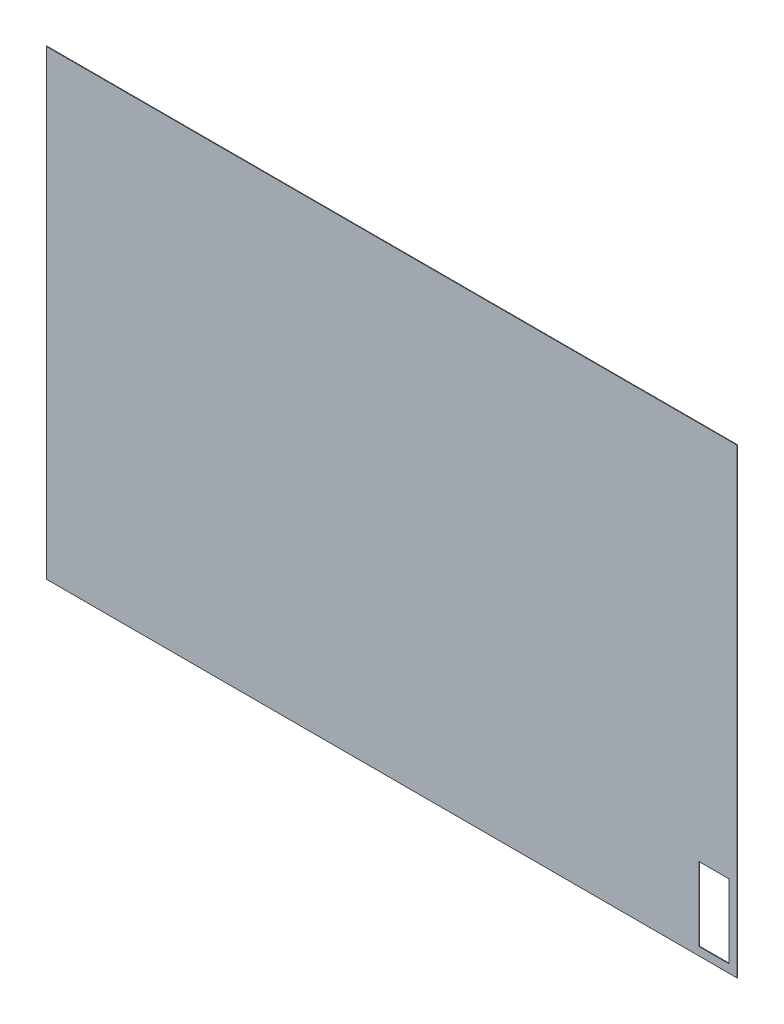
ISO-10303-21;
HEADER;
FILE_DESCRIPTION(('STEP AP214'),'2;1');
FILE_NAME('part.step','',(''),(''),'','','');
FILE_SCHEMA(('AUTOMOTIVE_DESIGN { 1 0 10303 214 1 1 1 1 }'));
ENDSEC;
DATA;
#1=APPLICATION_CONTEXT('core data for automotive mechanical design processes');
#2=APPLICATION_PROTOCOL_DEFINITION('international standard','automotive_design',2000,#1);
#3=PRODUCT_CONTEXT('',#1,'mechanical');
#4=PRODUCT('Part','Part','',(#3));
#5=PRODUCT_RELATED_PRODUCT_CATEGORY('part','',(#4));
#6=PRODUCT_DEFINITION_FORMATION('','',#4);
#7=PRODUCT_DEFINITION_CONTEXT('part definition',#1,'design');
#8=PRODUCT_DEFINITION('design','',#6,#7);
#9=PRODUCT_DEFINITION_SHAPE('','',#8);
#10=(LENGTH_UNIT() NAMED_UNIT(*) SI_UNIT(.MILLI.,.METRE.));
#11=(NAMED_UNIT(*) PLANE_ANGLE_UNIT() SI_UNIT($,.RADIAN.));
#12=(NAMED_UNIT(*) SI_UNIT($,.STERADIAN.) SOLID_ANGLE_UNIT());
#13=UNCERTAINTY_MEASURE_WITH_UNIT(LENGTH_MEASURE(1.E-05),#10,'distance_accuracy_value','');
#14=(GEOMETRIC_REPRESENTATION_CONTEXT(3) GLOBAL_UNCERTAINTY_ASSIGNED_CONTEXT((#13)) GLOBAL_UNIT_ASSIGNED_CONTEXT((#10,
#11,#12)) REPRESENTATION_CONTEXT('',''));
#15=CARTESIAN_POINT('',(0.,0.,0.));
#16=DIRECTION('',(0.,0.,1.));
#17=DIRECTION('',(1.,0.,0.));
#18=AXIS2_PLACEMENT_3D('',#15,#16,#17);
#19=CARTESIAN_POINT('',(0.,0.,2.));
#20=DIRECTION('',(0.,0.,-1.));
#21=DIRECTION('',(-1.,0.,0.));
#22=AXIS2_PLACEMENT_3D('',#19,#20,#21);
#23=PLANE('',#22);
#24=DIRECTION('',(0.,-1.,0.));
#25=VECTOR('',#24,1.);
#26=CARTESIAN_POINT('',(0.,0.,2.));
#27=LINE('',#26,#25);
#28=CARTESIAN_POINT('',(0.,1670.,2.));
#29=VERTEX_POINT('',#28);
#30=CARTESIAN_POINT('',(0.,0.,2.));
#31=VERTEX_POINT('',#30);
#32=EDGE_CURVE('E134',#29,#31,#27,.T.);
#33=ORIENTED_EDGE('',*,*,#32,.T.);
#34=DIRECTION('',(1.,0.,0.));
#35=VECTOR('',#34,1.);
#36=CARTESIAN_POINT('',(0.,0.,2.));
#37=LINE('',#36,#35);
#38=CARTESIAN_POINT('',(2500.,0.,2.));
#39=VERTEX_POINT('',#38);
#40=EDGE_CURVE('E137',#31,#39,#37,.T.);
#41=ORIENTED_EDGE('',*,*,#40,.T.);
#42=DIRECTION('',(0.,1.,0.));
#43=VECTOR('',#42,1.);
#44=CARTESIAN_POINT('',(2500.,0.,2.));
#45=LINE('',#44,#43);
#46=CARTESIAN_POINT('',(2500.,1670.,2.));
#47=VERTEX_POINT('',#46);
#48=EDGE_CURVE('E140',#39,#47,#45,.T.);
#49=ORIENTED_EDGE('',*,*,#48,.T.);
#50=DIRECTION('',(-1.,0.,0.));
#51=VECTOR('',#50,1.);
#52=CARTESIAN_POINT('',(0.,1670.,2.));
#53=LINE('',#52,#51);
#54=EDGE_CURVE('E142',#47,#29,#53,.T.);
#55=ORIENTED_EDGE('',*,*,#54,.T.);
#56=EDGE_LOOP('',(#33,#41,#49,#55));
#57=FACE_BOUND('',#56,.T.);
#58=DIRECTION('',(0.,1.,0.));
#59=VECTOR('',#58,1.);
#60=CARTESIAN_POINT('',(2470.,30.0000000000003,2.));
#61=LINE('',#60,#59);
#62=CARTESIAN_POINT('',(2470.,30.0000000000003,2.));
#63=VERTEX_POINT('',#62);
#64=CARTESIAN_POINT('',(2470.,296.000000000001,2.));
#65=VERTEX_POINT('',#64);
#66=EDGE_CURVE('E98',#63,#65,#61,.T.);
#67=ORIENTED_EDGE('',*,*,#66,.F.);
#68=DIRECTION('',(1.,0.,0.));
#69=VECTOR('',#68,1.);
#70=CARTESIAN_POINT('',(2470.,30.0000000000003,2.));
#71=LINE('',#70,#69);
#72=CARTESIAN_POINT('',(2361.56,30.0000000000004,2.));
#73=VERTEX_POINT('',#72);
#74=EDGE_CURVE('E120',#73,#63,#71,.T.);
#75=ORIENTED_EDGE('',*,*,#74,.F.);
#76=DIRECTION('',(0.,-1.,0.));
#77=VECTOR('',#76,1.);
#78=CARTESIAN_POINT('',(2361.56,30.0000000000004,2.));
#79=LINE('',#78,#77);
#80=CARTESIAN_POINT('',(2361.56,296.,2.));
#81=VERTEX_POINT('',#80);
#82=EDGE_CURVE('E118',#81,#73,#79,.T.);
#83=ORIENTED_EDGE('',*,*,#82,.F.);
#84=DIRECTION('',(-1.,0.,0.));
#85=VECTOR('',#84,1.);
#86=CARTESIAN_POINT('',(2470.,296.000000000001,2.));
#87=LINE('',#86,#85);
#88=EDGE_CURVE('E106',#65,#81,#87,.T.);
#89=ORIENTED_EDGE('',*,*,#88,.F.);
#90=EDGE_LOOP('',(#67,#75,#83,#89));
#91=FACE_BOUND('',#90,.T.);
#92=ADVANCED_FACE('F33',(#57,#91),#23,.F.);
#93=CARTESIAN_POINT('',(0.,0.,0.));
#94=DIRECTION('',(0.,0.,-1.));
#95=DIRECTION('',(-1.,0.,0.));
#96=AXIS2_PLACEMENT_3D('',#93,#94,#95);
#97=PLANE('',#96);
#98=DIRECTION('',(0.,-1.,0.));
#99=VECTOR('',#98,1.);
#100=CARTESIAN_POINT('',(0.,0.,0.));
#101=LINE('',#100,#99);
#102=CARTESIAN_POINT('',(0.,1670.,0.));
#103=VERTEX_POINT('',#102);
#104=CARTESIAN_POINT('',(0.,0.,0.));
#105=VERTEX_POINT('',#104);
#106=EDGE_CURVE('E114',#103,#105,#101,.T.);
#107=ORIENTED_EDGE('',*,*,#106,.F.);
#108=DIRECTION('',(-1.,0.,0.));
#109=VECTOR('',#108,1.);
#110=CARTESIAN_POINT('',(0.,1670.,0.));
#111=LINE('',#110,#109);
#112=CARTESIAN_POINT('',(2500.,1670.,0.));
#113=VERTEX_POINT('',#112);
#114=EDGE_CURVE('E138',#113,#103,#111,.T.);
#115=ORIENTED_EDGE('',*,*,#114,.F.);
#116=DIRECTION('',(0.,1.,0.));
#117=VECTOR('',#116,1.);
#118=CARTESIAN_POINT('',(2500.,0.,0.));
#119=LINE('',#118,#117);
#120=CARTESIAN_POINT('',(2500.,0.,0.));
#121=VERTEX_POINT('',#120);
#122=EDGE_CURVE('E149',#121,#113,#119,.T.);
#123=ORIENTED_EDGE('',*,*,#122,.F.);
#124=DIRECTION('',(1.,0.,0.));
#125=VECTOR('',#124,1.);
#126=CARTESIAN_POINT('',(0.,0.,0.));
#127=LINE('',#126,#125);
#128=EDGE_CURVE('E147',#105,#121,#127,.T.);
#129=ORIENTED_EDGE('',*,*,#128,.F.);
#130=EDGE_LOOP('',(#107,#115,#123,#129));
#131=FACE_BOUND('',#130,.T.);
#132=DIRECTION('',(1.,0.,0.));
#133=VECTOR('',#132,1.);
#134=CARTESIAN_POINT('',(2470.,30.0000000000003,0.));
#135=LINE('',#134,#133);
#136=CARTESIAN_POINT('',(2361.56,30.0000000000004,0.));
#137=VERTEX_POINT('',#136);
#138=CARTESIAN_POINT('',(2470.,30.0000000000003,0.));
#139=VERTEX_POINT('',#138);
#140=EDGE_CURVE('E107',#137,#139,#135,.T.);
#141=ORIENTED_EDGE('',*,*,#140,.T.);
#142=DIRECTION('',(0.,1.,0.));
#143=VECTOR('',#142,1.);
#144=CARTESIAN_POINT('',(2470.,30.0000000000003,0.));
#145=LINE('',#144,#143);
#146=CARTESIAN_POINT('',(2470.,296.000000000001,0.));
#147=VERTEX_POINT('',#146);
#148=EDGE_CURVE('E56',#139,#147,#145,.T.);
#149=ORIENTED_EDGE('',*,*,#148,.T.);
#150=DIRECTION('',(-1.,0.,0.));
#151=VECTOR('',#150,1.);
#152=CARTESIAN_POINT('',(2470.,296.000000000001,0.));
#153=LINE('',#152,#151);
#154=CARTESIAN_POINT('',(2361.56,296.,0.));
#155=VERTEX_POINT('',#154);
#156=EDGE_CURVE('E113',#147,#155,#153,.T.);
#157=ORIENTED_EDGE('',*,*,#156,.T.);
#158=DIRECTION('',(0.,-1.,0.));
#159=VECTOR('',#158,1.);
#160=CARTESIAN_POINT('',(2361.56,30.0000000000004,0.));
#161=LINE('',#160,#159);
#162=EDGE_CURVE('E126',#155,#137,#161,.T.);
#163=ORIENTED_EDGE('',*,*,#162,.T.);
#164=EDGE_LOOP('',(#141,#149,#157,#163));
#165=FACE_BOUND('',#164,.T.);
#166=ADVANCED_FACE('F167',(#131,#165),#97,.T.);
#167=CARTESIAN_POINT('',(0.,0.,2.));
#168=DIRECTION('',(1.,0.,0.));
#169=DIRECTION('',(0.,0.,-1.));
#170=AXIS2_PLACEMENT_3D('',#167,#168,#169);
#171=PLANE('',#170);
#172=ORIENTED_EDGE('',*,*,#106,.T.);
#173=DIRECTION('',(0.,0.,-1.));
#174=VECTOR('',#173,1.);
#175=CARTESIAN_POINT('',(0.,0.,2.));
#176=LINE('',#175,#174);
#177=EDGE_CURVE('E11',#31,#105,#176,.T.);
#178=ORIENTED_EDGE('',*,*,#177,.F.);
#179=ORIENTED_EDGE('',*,*,#32,.F.);
#180=DIRECTION('',(0.,0.,-1.));
#181=VECTOR('',#180,1.);
#182=CARTESIAN_POINT('',(0.,1670.,2.));
#183=LINE('',#182,#181);
#184=EDGE_CURVE('E144',#29,#103,#183,.T.);
#185=ORIENTED_EDGE('',*,*,#184,.T.);
#186=EDGE_LOOP('',(#172,#178,#179,#185));
#187=FACE_BOUND('',#186,.T.);
#188=ADVANCED_FACE('F35',(#187),#171,.F.);
#189=CARTESIAN_POINT('',(0.,0.,2.));
#190=DIRECTION('',(0.,1.,0.));
#191=DIRECTION('',(0.,0.,1.));
#192=AXIS2_PLACEMENT_3D('',#189,#190,#191);
#193=PLANE('',#192);
#194=ORIENTED_EDGE('',*,*,#128,.T.);
#195=DIRECTION('',(0.,0.,-1.));
#196=VECTOR('',#195,1.);
#197=CARTESIAN_POINT('',(2500.,0.,2.));
#198=LINE('',#197,#196);
#199=EDGE_CURVE('E41',#39,#121,#198,.T.);
#200=ORIENTED_EDGE('',*,*,#199,.F.);
#201=ORIENTED_EDGE('',*,*,#40,.F.);
#202=ORIENTED_EDGE('',*,*,#177,.T.);
#203=EDGE_LOOP('',(#194,#200,#201,#202));
#204=FACE_BOUND('',#203,.T.);
#205=ADVANCED_FACE('F177',(#204),#193,.F.);
#206=CARTESIAN_POINT('',(2500.,0.,2.));
#207=DIRECTION('',(-1.,0.,0.));
#208=DIRECTION('',(0.,0.,1.));
#209=AXIS2_PLACEMENT_3D('',#206,#207,#208);
#210=PLANE('',#209);
#211=ORIENTED_EDGE('',*,*,#122,.T.);
#212=DIRECTION('',(0.,0.,-1.));
#213=VECTOR('',#212,1.);
#214=CARTESIAN_POINT('',(2500.,1670.,2.));
#215=LINE('',#214,#213);
#216=EDGE_CURVE('E154',#47,#113,#215,.T.);
#217=ORIENTED_EDGE('',*,*,#216,.F.);
#218=ORIENTED_EDGE('',*,*,#48,.F.);
#219=ORIENTED_EDGE('',*,*,#199,.T.);
#220=EDGE_LOOP('',(#211,#217,#218,#219));
#221=FACE_BOUND('',#220,.T.);
#222=ADVANCED_FACE('F161',(#221),#210,.F.);
#223=CARTESIAN_POINT('',(0.,1670.,2.));
#224=DIRECTION('',(0.,-1.,0.));
#225=DIRECTION('',(0.,0.,-1.));
#226=AXIS2_PLACEMENT_3D('',#223,#224,#225);
#227=PLANE('',#226);
#228=ORIENTED_EDGE('',*,*,#114,.T.);
#229=ORIENTED_EDGE('',*,*,#184,.F.);
#230=ORIENTED_EDGE('',*,*,#54,.F.);
#231=ORIENTED_EDGE('',*,*,#216,.T.);
#232=EDGE_LOOP('',(#228,#229,#230,#231));
#233=FACE_BOUND('',#232,.T.);
#234=ADVANCED_FACE('F171',(#233),#227,.F.);
#235=CARTESIAN_POINT('',(2470.,30.0000000000003,2.));
#236=DIRECTION('',(-1.,0.,0.));
#237=DIRECTION('',(0.,0.,1.));
#238=AXIS2_PLACEMENT_3D('',#235,#236,#237);
#239=PLANE('',#238);
#240=ORIENTED_EDGE('',*,*,#148,.F.);
#241=DIRECTION('',(0.,0.,-1.));
#242=VECTOR('',#241,1.);
#243=CARTESIAN_POINT('',(2470.,30.0000000000003,2.));
#244=LINE('',#243,#242);
#245=EDGE_CURVE('E102',#63,#139,#244,.T.);
#246=ORIENTED_EDGE('',*,*,#245,.F.);
#247=ORIENTED_EDGE('',*,*,#66,.T.);
#248=DIRECTION('',(0.,0.,-1.));
#249=VECTOR('',#248,1.);
#250=CARTESIAN_POINT('',(2470.,296.000000000001,2.));
#251=LINE('',#250,#249);
#252=EDGE_CURVE('E101',#65,#147,#251,.T.);
#253=ORIENTED_EDGE('',*,*,#252,.T.);
#254=EDGE_LOOP('',(#240,#246,#247,#253));
#255=FACE_BOUND('',#254,.T.);
#256=ADVANCED_FACE('F100',(#255),#239,.T.);
#257=CARTESIAN_POINT('',(2470.,296.000000000001,2.));
#258=DIRECTION('',(0.,-1.,0.));
#259=DIRECTION('',(1.,0.,0.));
#260=AXIS2_PLACEMENT_3D('',#257,#258,#259);
#261=PLANE('',#260);
#262=ORIENTED_EDGE('',*,*,#156,.F.);
#263=ORIENTED_EDGE('',*,*,#252,.F.);
#264=ORIENTED_EDGE('',*,*,#88,.T.);
#265=DIRECTION('',(0.,0.,-1.));
#266=VECTOR('',#265,1.);
#267=CARTESIAN_POINT('',(2361.56,296.,2.));
#268=LINE('',#267,#266);
#269=EDGE_CURVE('E115',#81,#155,#268,.T.);
#270=ORIENTED_EDGE('',*,*,#269,.T.);
#271=EDGE_LOOP('',(#262,#263,#264,#270));
#272=FACE_BOUND('',#271,.T.);
#273=ADVANCED_FACE('F110',(#272),#261,.T.);
#274=CARTESIAN_POINT('',(2361.56,30.0000000000004,2.));
#275=DIRECTION('',(1.,0.,0.));
#276=DIRECTION('',(0.,1.,0.));
#277=AXIS2_PLACEMENT_3D('',#274,#275,#276);
#278=PLANE('',#277);
#279=ORIENTED_EDGE('',*,*,#162,.F.);
#280=ORIENTED_EDGE('',*,*,#269,.F.);
#281=ORIENTED_EDGE('',*,*,#82,.T.);
#282=DIRECTION('',(0.,0.,-1.));
#283=VECTOR('',#282,1.);
#284=CARTESIAN_POINT('',(2361.56,30.0000000000004,2.));
#285=LINE('',#284,#283);
#286=EDGE_CURVE('E48',#73,#137,#285,.T.);
#287=ORIENTED_EDGE('',*,*,#286,.T.);
#288=EDGE_LOOP('',(#279,#280,#281,#287));
#289=FACE_BOUND('',#288,.T.);
#290=ADVANCED_FACE('F200',(#289),#278,.T.);
#291=CARTESIAN_POINT('',(2470.,30.0000000000003,2.));
#292=DIRECTION('',(0.,1.,0.));
#293=DIRECTION('',(-1.,0.,0.));
#294=AXIS2_PLACEMENT_3D('',#291,#292,#293);
#295=PLANE('',#294);
#296=ORIENTED_EDGE('',*,*,#140,.F.);
#297=ORIENTED_EDGE('',*,*,#286,.F.);
#298=ORIENTED_EDGE('',*,*,#74,.T.);
#299=ORIENTED_EDGE('',*,*,#245,.T.);
#300=EDGE_LOOP('',(#296,#297,#298,#299));
#301=FACE_BOUND('',#300,.T.);
#302=ADVANCED_FACE('F204',(#301),#295,.T.);
#303=CLOSED_SHELL('',(#92,#166,#188,#205,#222,#234,#256,#273,#290,#302));
#304=MANIFOLD_SOLID_BREP('B2',#303);
#305=ADVANCED_BREP_SHAPE_REPRESENTATION('',(#18,#304),#14);
#306=SHAPE_DEFINITION_REPRESENTATION(#9,#305);
ENDSEC;
END-ISO-10303-21;
